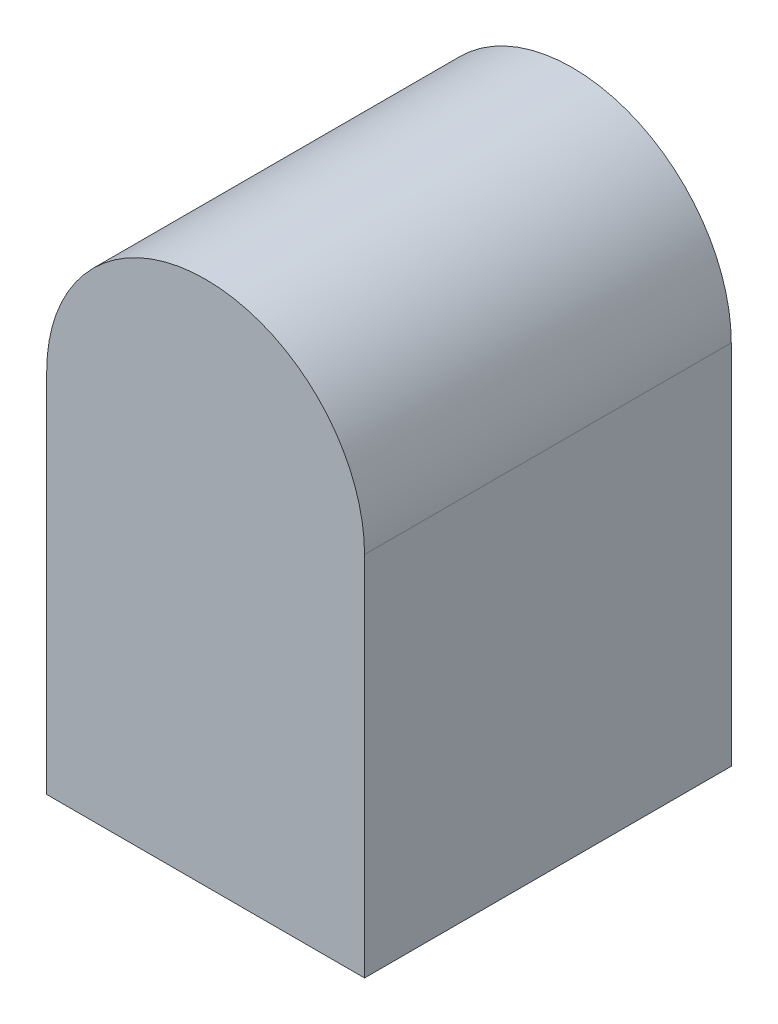
ISO-10303-21;
HEADER;
FILE_DESCRIPTION(('STEP AP214'),'2;1');
FILE_NAME('part.step','',(''),(''),'','','');
FILE_SCHEMA(('AUTOMOTIVE_DESIGN { 1 0 10303 214 1 1 1 1 }'));
ENDSEC;
DATA;
#1=APPLICATION_CONTEXT('core data for automotive mechanical design processes');
#2=APPLICATION_PROTOCOL_DEFINITION('international standard','automotive_design',2000,#1);
#3=PRODUCT_CONTEXT('',#1,'mechanical');
#4=PRODUCT('Part','Part','',(#3));
#5=PRODUCT_RELATED_PRODUCT_CATEGORY('part','',(#4));
#6=PRODUCT_DEFINITION_FORMATION('','',#4);
#7=PRODUCT_DEFINITION_CONTEXT('part definition',#1,'design');
#8=PRODUCT_DEFINITION('design','',#6,#7);
#9=PRODUCT_DEFINITION_SHAPE('','',#8);
#10=(LENGTH_UNIT() NAMED_UNIT(*) SI_UNIT(.MILLI.,.METRE.));
#11=(NAMED_UNIT(*) PLANE_ANGLE_UNIT() SI_UNIT($,.RADIAN.));
#12=(NAMED_UNIT(*) SI_UNIT($,.STERADIAN.) SOLID_ANGLE_UNIT());
#13=UNCERTAINTY_MEASURE_WITH_UNIT(LENGTH_MEASURE(1.E-05),#10,'distance_accuracy_value','');
#14=(GEOMETRIC_REPRESENTATION_CONTEXT(3) GLOBAL_UNCERTAINTY_ASSIGNED_CONTEXT((#13)) GLOBAL_UNIT_ASSIGNED_CONTEXT((#10,
#11,#12)) REPRESENTATION_CONTEXT('',''));
#15=CARTESIAN_POINT('',(0.,0.,0.));
#16=DIRECTION('',(0.,0.,1.));
#17=DIRECTION('',(1.,0.,0.));
#18=AXIS2_PLACEMENT_3D('',#15,#16,#17);
#19=CARTESIAN_POINT('',(13.,0.,30.));
#20=DIRECTION('',(0.,0.,-1.));
#21=DIRECTION('',(-1.,0.,0.));
#22=AXIS2_PLACEMENT_3D('',#19,#20,#21);
#23=CYLINDRICAL_SURFACE('',#22,13.);
#24=CARTESIAN_POINT('',(13.,0.,0.));
#25=DIRECTION('',(0.,0.,1.));
#26=DIRECTION('',(1.,0.,0.));
#27=AXIS2_PLACEMENT_3D('',#24,#25,#26);
#28=CIRCLE('',#27,13.);
#29=CARTESIAN_POINT('',(26.,0.,0.));
#30=VERTEX_POINT('',#29);
#31=CARTESIAN_POINT('',(0.,0.,0.));
#32=VERTEX_POINT('',#31);
#33=EDGE_CURVE('E103',#30,#32,#28,.T.);
#34=ORIENTED_EDGE('',*,*,#33,.T.);
#35=DIRECTION('',(0.,0.,-1.));
#36=VECTOR('',#35,1.);
#37=CARTESIAN_POINT('',(0.,0.,30.));
#38=LINE('',#37,#36);
#39=CARTESIAN_POINT('',(0.,0.,30.));
#40=VERTEX_POINT('',#39);
#41=EDGE_CURVE('E45',#40,#32,#38,.T.);
#42=ORIENTED_EDGE('',*,*,#41,.F.);
#43=CARTESIAN_POINT('',(13.,0.,30.));
#44=DIRECTION('',(0.,0.,1.));
#45=DIRECTION('',(1.,0.,0.));
#46=AXIS2_PLACEMENT_3D('',#43,#44,#45);
#47=CIRCLE('',#46,13.);
#48=CARTESIAN_POINT('',(26.,0.,30.));
#49=VERTEX_POINT('',#48);
#50=EDGE_CURVE('E89',#49,#40,#47,.T.);
#51=ORIENTED_EDGE('',*,*,#50,.F.);
#52=DIRECTION('',(0.,0.,-1.));
#53=VECTOR('',#52,1.);
#54=CARTESIAN_POINT('',(26.,0.,30.));
#55=LINE('',#54,#53);
#56=EDGE_CURVE('E99',#49,#30,#55,.T.);
#57=ORIENTED_EDGE('',*,*,#56,.T.);
#58=EDGE_LOOP('',(#34,#42,#51,#57));
#59=FACE_BOUND('',#58,.T.);
#60=ADVANCED_FACE('F37',(#59),#23,.T.);
#61=CARTESIAN_POINT('',(0.,0.,30.));
#62=DIRECTION('',(1.,0.,0.));
#63=DIRECTION('',(0.,0.,-1.));
#64=AXIS2_PLACEMENT_3D('',#61,#62,#63);
#65=PLANE('',#64);
#66=DIRECTION('',(0.,-1.,0.));
#67=VECTOR('',#66,1.);
#68=CARTESIAN_POINT('',(0.,0.,0.));
#69=LINE('',#68,#67);
#70=CARTESIAN_POINT('',(0.,-30.,0.));
#71=VERTEX_POINT('',#70);
#72=EDGE_CURVE('E94',#32,#71,#69,.T.);
#73=ORIENTED_EDGE('',*,*,#72,.T.);
#74=DIRECTION('',(0.,0.,-1.));
#75=VECTOR('',#74,1.);
#76=CARTESIAN_POINT('',(0.,-30.,30.));
#77=LINE('',#76,#75);
#78=CARTESIAN_POINT('',(0.,-30.,30.));
#79=VERTEX_POINT('',#78);
#80=EDGE_CURVE('E92',#79,#71,#77,.T.);
#81=ORIENTED_EDGE('',*,*,#80,.F.);
#82=DIRECTION('',(0.,-1.,0.));
#83=VECTOR('',#82,1.);
#84=CARTESIAN_POINT('',(0.,0.,30.));
#85=LINE('',#84,#83);
#86=EDGE_CURVE('E84',#40,#79,#85,.T.);
#87=ORIENTED_EDGE('',*,*,#86,.F.);
#88=ORIENTED_EDGE('',*,*,#41,.T.);
#89=EDGE_LOOP('',(#73,#81,#87,#88));
#90=FACE_BOUND('',#89,.T.);
#91=ADVANCED_FACE('F93',(#90),#65,.F.);
#92=CARTESIAN_POINT('',(0.,-30.,30.));
#93=DIRECTION('',(0.,1.,0.));
#94=DIRECTION('',(0.,0.,1.));
#95=AXIS2_PLACEMENT_3D('',#92,#93,#94);
#96=PLANE('',#95);
#97=DIRECTION('',(1.,0.,0.));
#98=VECTOR('',#97,1.);
#99=CARTESIAN_POINT('',(0.,-30.,0.));
#100=LINE('',#99,#98);
#101=CARTESIAN_POINT('',(26.,-30.,0.));
#102=VERTEX_POINT('',#101);
#103=EDGE_CURVE('E70',#71,#102,#100,.T.);
#104=ORIENTED_EDGE('',*,*,#103,.T.);
#105=DIRECTION('',(0.,0.,-1.));
#106=VECTOR('',#105,1.);
#107=CARTESIAN_POINT('',(26.,-30.,30.));
#108=LINE('',#107,#106);
#109=CARTESIAN_POINT('',(26.,-30.,30.));
#110=VERTEX_POINT('',#109);
#111=EDGE_CURVE('E95',#110,#102,#108,.T.);
#112=ORIENTED_EDGE('',*,*,#111,.F.);
#113=DIRECTION('',(1.,0.,0.));
#114=VECTOR('',#113,1.);
#115=CARTESIAN_POINT('',(0.,-30.,30.));
#116=LINE('',#115,#114);
#117=EDGE_CURVE('E87',#79,#110,#116,.T.);
#118=ORIENTED_EDGE('',*,*,#117,.F.);
#119=ORIENTED_EDGE('',*,*,#80,.T.);
#120=EDGE_LOOP('',(#104,#112,#118,#119));
#121=FACE_BOUND('',#120,.T.);
#122=ADVANCED_FACE('F97',(#121),#96,.F.);
#123=CARTESIAN_POINT('',(26.,0.,30.));
#124=DIRECTION('',(-1.,0.,0.));
#125=DIRECTION('',(0.,-1.,0.));
#126=AXIS2_PLACEMENT_3D('',#123,#124,#125);
#127=PLANE('',#126);
#128=DIRECTION('',(0.,1.,0.));
#129=VECTOR('',#128,1.);
#130=CARTESIAN_POINT('',(26.,0.,0.));
#131=LINE('',#130,#129);
#132=EDGE_CURVE('E76',#102,#30,#131,.T.);
#133=ORIENTED_EDGE('',*,*,#132,.T.);
#134=ORIENTED_EDGE('',*,*,#56,.F.);
#135=DIRECTION('',(0.,1.,0.));
#136=VECTOR('',#135,1.);
#137=CARTESIAN_POINT('',(26.,0.,30.));
#138=LINE('',#137,#136);
#139=EDGE_CURVE('E53',#110,#49,#138,.T.);
#140=ORIENTED_EDGE('',*,*,#139,.F.);
#141=ORIENTED_EDGE('',*,*,#111,.T.);
#142=EDGE_LOOP('',(#133,#134,#140,#141));
#143=FACE_BOUND('',#142,.T.);
#144=ADVANCED_FACE('F126',(#143),#127,.F.);
#145=CARTESIAN_POINT('',(13.,0.,30.));
#146=DIRECTION('',(0.,0.,1.));
#147=DIRECTION('',(1.,0.,0.));
#148=AXIS2_PLACEMENT_3D('',#145,#146,#147);
#149=PLANE('',#148);
#150=ORIENTED_EDGE('',*,*,#50,.T.);
#151=ORIENTED_EDGE('',*,*,#86,.T.);
#152=ORIENTED_EDGE('',*,*,#117,.T.);
#153=ORIENTED_EDGE('',*,*,#139,.T.);
#154=EDGE_LOOP('',(#150,#151,#152,#153));
#155=FACE_BOUND('',#154,.T.);
#156=ADVANCED_FACE('F85',(#155),#149,.T.);
#157=CARTESIAN_POINT('',(13.,0.,0.));
#158=DIRECTION('',(0.,0.,1.));
#159=DIRECTION('',(1.,0.,0.));
#160=AXIS2_PLACEMENT_3D('',#157,#158,#159);
#161=PLANE('',#160);
#162=CARTESIAN_POINT('',(13.,-9.99999999999999,0.));
#163=DIRECTION('',(0.,0.,1.));
#164=DIRECTION('',(1.,0.,0.));
#165=AXIS2_PLACEMENT_3D('',#162,#163,#164);
#166=CIRCLE('',#165,2.5);
#167=CARTESIAN_POINT('',(15.5,-9.99999999999999,0.));
#168=VERTEX_POINT('',#167);
#169=EDGE_CURVE('E11',#168,#168,#166,.F.);
#170=ORIENTED_EDGE('',*,*,#169,.F.);
#171=EDGE_LOOP('',(#170));
#172=FACE_BOUND('',#171,.T.);
#173=ORIENTED_EDGE('',*,*,#33,.F.);
#174=ORIENTED_EDGE('',*,*,#132,.F.);
#175=ORIENTED_EDGE('',*,*,#103,.F.);
#176=ORIENTED_EDGE('',*,*,#72,.F.);
#177=EDGE_LOOP('',(#173,#174,#175,#176));
#178=FACE_BOUND('',#177,.T.);
#179=ADVANCED_FACE('F114',(#172,#178),#161,.F.);
#180=CARTESIAN_POINT('',(13.,-9.99999999999999,-10.));
#181=DIRECTION('',(0.,0.,1.));
#182=DIRECTION('',(1.,0.,0.));
#183=AXIS2_PLACEMENT_3D('',#180,#181,#182);
#184=CYLINDRICAL_SURFACE('',#183,2.5);
#185=CARTESIAN_POINT('',(13.,-9.99999999999999,-10.));
#186=DIRECTION('',(0.,0.,-1.));
#187=DIRECTION('',(-1.,0.,0.));
#188=AXIS2_PLACEMENT_3D('',#185,#186,#187);
#189=CIRCLE('',#188,2.5);
#190=CARTESIAN_POINT('',(10.5,-9.99999999999999,-10.));
#191=VERTEX_POINT('',#190);
#192=EDGE_CURVE('E106',#191,#191,#189,.T.);
#193=ORIENTED_EDGE('',*,*,#192,.F.);
#194=EDGE_LOOP('',(#193));
#195=FACE_BOUND('',#194,.T.);
#196=ORIENTED_EDGE('',*,*,#169,.T.);
#197=EDGE_LOOP('',(#196));
#198=FACE_BOUND('',#197,.T.);
#199=ADVANCED_FACE('F116',(#195,#198),#184,.T.);
#200=CARTESIAN_POINT('',(13.,-9.99999999999999,-10.));
#201=DIRECTION('',(0.,0.,-1.));
#202=DIRECTION('',(-1.,0.,0.));
#203=AXIS2_PLACEMENT_3D('',#200,#201,#202);
#204=PLANE('',#203);
#205=ORIENTED_EDGE('',*,*,#192,.T.);
#206=EDGE_LOOP('',(#205));
#207=FACE_BOUND('',#206,.T.);
#208=ADVANCED_FACE('F123',(#207),#204,.T.);
#209=CLOSED_SHELL('',(#60,#91,#122,#144,#156,#179,#199,#208));
#210=MANIFOLD_SOLID_BREP('B2',#209);
#211=ADVANCED_BREP_SHAPE_REPRESENTATION('',(#18,#210),#14);
#212=SHAPE_DEFINITION_REPRESENTATION(#9,#211);
ENDSEC;
END-ISO-10303-21;
